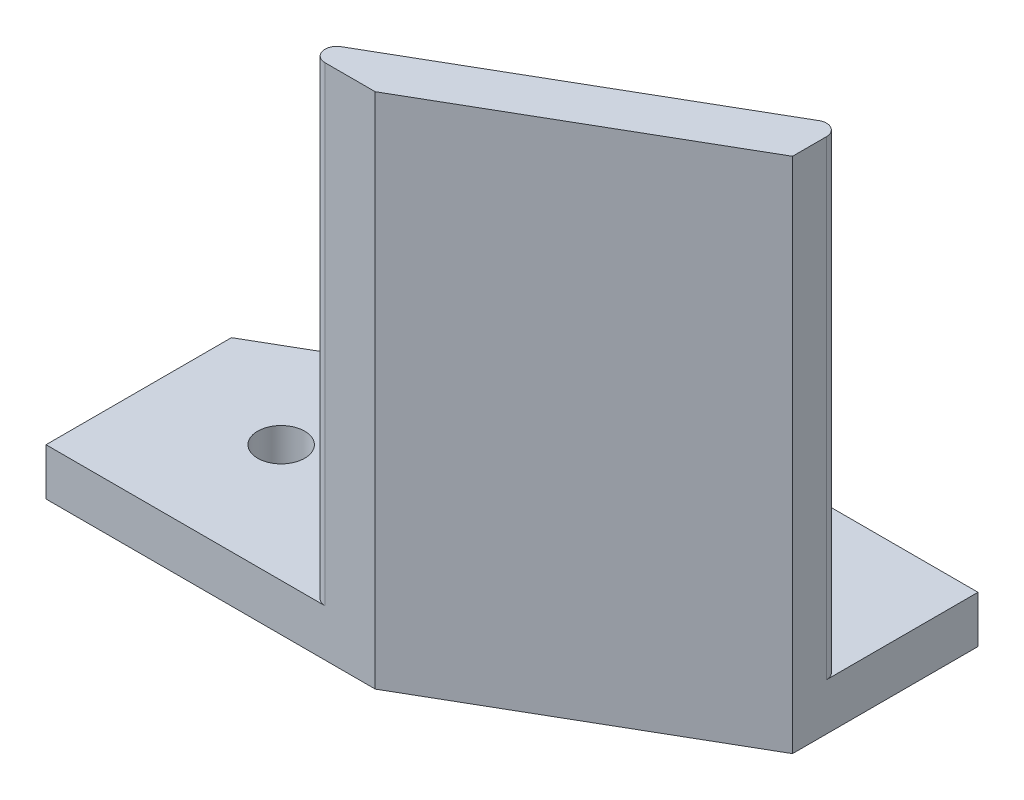
ISO-10303-21;
HEADER;
FILE_DESCRIPTION(('STEP AP214'),'2;1');
FILE_NAME('part.step','',(''),(''),'','','');
FILE_SCHEMA(('AUTOMOTIVE_DESIGN { 1 0 10303 214 1 1 1 1 }'));
ENDSEC;
DATA;
#1=APPLICATION_CONTEXT('core data for automotive mechanical design processes');
#2=APPLICATION_PROTOCOL_DEFINITION('international standard','automotive_design',2000,#1);
#3=PRODUCT_CONTEXT('',#1,'mechanical');
#4=PRODUCT('Part','Part','',(#3));
#5=PRODUCT_RELATED_PRODUCT_CATEGORY('part','',(#4));
#6=PRODUCT_DEFINITION_FORMATION('','',#4);
#7=PRODUCT_DEFINITION_CONTEXT('part definition',#1,'design');
#8=PRODUCT_DEFINITION('design','',#6,#7);
#9=PRODUCT_DEFINITION_SHAPE('','',#8);
#10=(LENGTH_UNIT() NAMED_UNIT(*) SI_UNIT(.MILLI.,.METRE.));
#11=(NAMED_UNIT(*) PLANE_ANGLE_UNIT() SI_UNIT($,.RADIAN.));
#12=(NAMED_UNIT(*) SI_UNIT($,.STERADIAN.) SOLID_ANGLE_UNIT());
#13=UNCERTAINTY_MEASURE_WITH_UNIT(LENGTH_MEASURE(1.E-05),#10,'distance_accuracy_value','');
#14=(GEOMETRIC_REPRESENTATION_CONTEXT(3) GLOBAL_UNCERTAINTY_ASSIGNED_CONTEXT((#13)) GLOBAL_UNIT_ASSIGNED_CONTEXT((#10,
#11,#12)) REPRESENTATION_CONTEXT('',''));
#15=CARTESIAN_POINT('',(0.,0.,0.));
#16=DIRECTION('',(0.,0.,1.));
#17=DIRECTION('',(1.,0.,0.));
#18=AXIS2_PLACEMENT_3D('',#15,#16,#17);
#19=CARTESIAN_POINT('',(71.,51.986195028983,0.));
#20=DIRECTION('',(0.,-1.,0.));
#21=DIRECTION('',(-1.,0.,0.));
#22=AXIS2_PLACEMENT_3D('',#19,#20,#21);
#23=PLANE('',#22);
#24=CARTESIAN_POINT('',(47.0897459621554,51.986195028983,18.));
#25=DIRECTION('',(0.,1.,0.));
#26=DIRECTION('',(-1.,0.,0.));
#27=AXIS2_PLACEMENT_3D('',#24,#25,#26);
#28=CIRCLE('',#27,1.00000000000001);
#29=CARTESIAN_POINT('',(46.0897459621554,51.986195028983,18.));
#30=VERTEX_POINT('',#29);
#31=EDGE_CURVE('E202',#30,#30,#28,.T.);
#32=ORIENTED_EDGE('',*,*,#31,.F.);
#33=EDGE_LOOP('',(#32));
#34=FACE_BOUND('',#33,.T.);
#35=CARTESIAN_POINT('',(40.5,51.986195028983,21.8045916051417));
#36=DIRECTION('',(0.,1.,0.));
#37=DIRECTION('',(-1.,0.,0.));
#38=AXIS2_PLACEMENT_3D('',#35,#36,#37);
#39=CIRCLE('',#38,1.);
#40=CARTESIAN_POINT('',(39.5,51.986195028983,21.8045916051417));
#41=VERTEX_POINT('',#40);
#42=EDGE_CURVE('E199',#41,#41,#39,.F.);
#43=ORIENTED_EDGE('',*,*,#42,.T.);
#44=EDGE_LOOP('',(#43));
#45=FACE_BOUND('',#44,.T.);
#46=DIRECTION('',(0.866025403784442,0.,-0.499999999999995));
#47=VECTOR('',#46,1.);
#48=CARTESIAN_POINT('',(76.23172863406,51.986195028983,9.06161980560487));
#49=LINE('',#48,#47);
#50=CARTESIAN_POINT('',(47.1160254037845,51.986195028983,25.8715789032495));
#51=VERTEX_POINT('',#50);
#52=CARTESIAN_POINT('',(60.,51.986195028983,18.4330127018922));
#53=VERTEX_POINT('',#52);
#54=EDGE_CURVE('E141',#51,#53,#49,.T.);
#55=ORIENTED_EDGE('',*,*,#54,.T.);
#56=CARTESIAN_POINT('',(60.25,51.986195028983,18.8660254037844));
#57=DIRECTION('',(0.,1.,0.));
#58=DIRECTION('',(-1.,0.,0.));
#59=AXIS2_PLACEMENT_3D('',#56,#57,#58);
#60=CIRCLE('',#59,0.5);
#61=CARTESIAN_POINT('',(60.75,51.986195028983,18.8660254037844));
#62=VERTEX_POINT('',#61);
#63=EDGE_CURVE('E53',#62,#53,#60,.T.);
#64=ORIENTED_EDGE('',*,*,#63,.F.);
#65=DIRECTION('',(0.,0.,-1.));
#66=VECTOR('',#65,1.);
#67=CARTESIAN_POINT('',(60.75,51.986195028983,0.));
#68=LINE('',#67,#66);
#69=CARTESIAN_POINT('',(60.75,51.986195028983,12.4226497308104));
#70=VERTEX_POINT('',#69);
#71=EDGE_CURVE('E207',#62,#70,#68,.T.);
#72=ORIENTED_EDGE('',*,*,#71,.T.);
#73=DIRECTION('',(1.,0.,0.));
#74=VECTOR('',#73,1.);
#75=CARTESIAN_POINT('',(71.,51.986195028983,12.4226497308104));
#76=LINE('',#75,#74);
#77=CARTESIAN_POINT('',(46.7499999999998,51.986195028983,12.4226497308104));
#78=VERTEX_POINT('',#77);
#79=EDGE_CURVE('E209',#78,#70,#76,.T.);
#80=ORIENTED_EDGE('',*,*,#79,.F.);
#81=DIRECTION('',(0.866025403784439,0.,-0.5));
#82=VECTOR('',#81,1.);
#83=CARTESIAN_POINT('',(70.3166651245988,51.986195028983,-1.18357072277864));
#84=LINE('',#83,#82);
#85=CARTESIAN_POINT('',(35.5,51.986195028983,18.9178402591935));
#86=VERTEX_POINT('',#85);
#87=EDGE_CURVE('E212',#86,#78,#84,.T.);
#88=ORIENTED_EDGE('',*,*,#87,.F.);
#89=DIRECTION('',(0.,0.,1.));
#90=VECTOR('',#89,1.);
#91=CARTESIAN_POINT('',(35.5,51.986195028983,0.));
#92=LINE('',#91,#90);
#93=CARTESIAN_POINT('',(35.5,51.986195028983,26.8045916051417));
#94=VERTEX_POINT('',#93);
#95=EDGE_CURVE('E183',#86,#94,#92,.T.);
#96=ORIENTED_EDGE('',*,*,#95,.T.);
#97=DIRECTION('',(1.,0.,0.));
#98=VECTOR('',#97,1.);
#99=CARTESIAN_POINT('',(71.,51.986195028983,26.8045916051417));
#100=LINE('',#99,#98);
#101=CARTESIAN_POINT('',(47.3660254037845,51.986195028983,26.8045916051417));
#102=VERTEX_POINT('',#101);
#103=EDGE_CURVE('E205',#94,#102,#100,.T.);
#104=ORIENTED_EDGE('',*,*,#103,.T.);
#105=CARTESIAN_POINT('',(47.3660254037845,51.986195028983,26.3045916051417));
#106=DIRECTION('',(0.,1.,0.));
#107=DIRECTION('',(-1.,0.,0.));
#108=AXIS2_PLACEMENT_3D('',#105,#106,#107);
#109=CIRCLE('',#108,0.5);
#110=EDGE_CURVE('E11',#51,#102,#109,.T.);
#111=ORIENTED_EDGE('',*,*,#110,.F.);
#112=EDGE_LOOP('',(#55,#64,#72,#80,#88,#96,#104,#111));
#113=FACE_BOUND('',#112,.T.);
#114=ADVANCED_FACE('F45',(#34,#45,#113),#23,.F.);
#115=CARTESIAN_POINT('',(71.,49.986195028983,26.8045916051417));
#116=DIRECTION('',(0.,0.,-1.));
#117=DIRECTION('',(0.,1.,0.));
#118=AXIS2_PLACEMENT_3D('',#115,#116,#117);
#119=PLANE('',#118);
#120=ORIENTED_EDGE('',*,*,#103,.F.);
#121=DIRECTION('',(0.,1.,0.));
#122=VECTOR('',#121,1.);
#123=CARTESIAN_POINT('',(35.5,49.986195028983,26.8045916051417));
#124=LINE('',#123,#122);
#125=CARTESIAN_POINT('',(35.5,49.986195028983,26.8045916051417));
#126=VERTEX_POINT('',#125);
#127=EDGE_CURVE('E198',#126,#94,#124,.T.);
#128=ORIENTED_EDGE('',*,*,#127,.F.);
#129=DIRECTION('',(1.,0.,0.));
#130=VECTOR('',#129,1.);
#131=CARTESIAN_POINT('',(71.,49.986195028983,26.8045916051417));
#132=LINE('',#131,#130);
#133=CARTESIAN_POINT('',(49.5000000000002,49.986195028983,26.8045916051417));
#134=VERTEX_POINT('',#133);
#135=EDGE_CURVE('E186',#126,#134,#132,.T.);
#136=ORIENTED_EDGE('',*,*,#135,.T.);
#137=DIRECTION('',(0.,1.,0.));
#138=VECTOR('',#137,1.);
#139=CARTESIAN_POINT('',(49.5000000000002,49.986195028983,26.8045916051417));
#140=LINE('',#139,#138);
#141=CARTESIAN_POINT('',(49.5000000000002,71.986195028983,26.8045916051417));
#142=VERTEX_POINT('',#141);
#143=EDGE_CURVE('E145',#134,#142,#140,.T.);
#144=ORIENTED_EDGE('',*,*,#143,.T.);
#145=DIRECTION('',(1.,0.,0.));
#146=VECTOR('',#145,1.);
#147=CARTESIAN_POINT('',(71.,71.986195028983,26.8045916051417));
#148=LINE('',#147,#146);
#149=CARTESIAN_POINT('',(47.3660254037845,71.986195028983,26.8045916051417));
#150=VERTEX_POINT('',#149);
#151=EDGE_CURVE('E137',#150,#142,#148,.T.);
#152=ORIENTED_EDGE('',*,*,#151,.F.);
#153=DIRECTION('',(0.,-1.,0.));
#154=VECTOR('',#153,1.);
#155=CARTESIAN_POINT('',(47.3660254037845,49.986195028983,26.8045916051417));
#156=LINE('',#155,#154);
#157=EDGE_CURVE('E60',#102,#150,#156,.F.);
#158=ORIENTED_EDGE('',*,*,#157,.F.);
#159=EDGE_LOOP('',(#120,#128,#136,#144,#152,#158));
#160=FACE_BOUND('',#159,.T.);
#161=ADVANCED_FACE('F237',(#160),#119,.F.);
#162=CARTESIAN_POINT('',(77.23172863406,49.986195028983,10.7936706131736));
#163=DIRECTION('',(-0.5,0.,-0.866025403784438));
#164=DIRECTION('',(0.866025403784439,0.,-0.5));
#165=AXIS2_PLACEMENT_3D('',#162,#163,#164);
#166=PLANE('',#165);
#167=ORIENTED_EDGE('',*,*,#143,.F.);
#168=DIRECTION('',(0.866025403784439,0.,-0.5));
#169=VECTOR('',#168,1.);
#170=CARTESIAN_POINT('',(77.23172863406,49.986195028983,10.7936706131736));
#171=LINE('',#170,#169);
#172=CARTESIAN_POINT('',(60.75,49.986195028983,20.3094010767585));
#173=VERTEX_POINT('',#172);
#174=EDGE_CURVE('E144',#134,#173,#171,.T.);
#175=ORIENTED_EDGE('',*,*,#174,.T.);
#176=DIRECTION('',(0.,1.,0.));
#177=VECTOR('',#176,1.);
#178=CARTESIAN_POINT('',(60.75,49.986195028983,20.3094010767585));
#179=LINE('',#178,#177);
#180=CARTESIAN_POINT('',(60.75,71.986195028983,20.3094010767585));
#181=VERTEX_POINT('',#180);
#182=EDGE_CURVE('E129',#173,#181,#179,.T.);
#183=ORIENTED_EDGE('',*,*,#182,.T.);
#184=DIRECTION('',(0.866025403784439,0.,-0.5));
#185=VECTOR('',#184,1.);
#186=CARTESIAN_POINT('',(77.23172863406,71.986195028983,10.7936706131736));
#187=LINE('',#186,#185);
#188=EDGE_CURVE('E134',#142,#181,#187,.T.);
#189=ORIENTED_EDGE('',*,*,#188,.F.);
#190=EDGE_LOOP('',(#167,#175,#183,#189));
#191=FACE_BOUND('',#190,.T.);
#192=ADVANCED_FACE('F143',(#191),#166,.F.);
#193=CARTESIAN_POINT('',(60.75,49.986195028983,0.));
#194=DIRECTION('',(-1.,0.,0.));
#195=DIRECTION('',(0.,0.,-1.));
#196=AXIS2_PLACEMENT_3D('',#193,#194,#195);
#197=PLANE('',#196);
#198=DIRECTION('',(0.,0.,-1.));
#199=VECTOR('',#198,1.);
#200=CARTESIAN_POINT('',(60.75,71.986195028983,0.));
#201=LINE('',#200,#199);
#202=CARTESIAN_POINT('',(60.75,71.986195028983,18.8660254037844));
#203=VERTEX_POINT('',#202);
#204=EDGE_CURVE('E124',#181,#203,#201,.T.);
#205=ORIENTED_EDGE('',*,*,#204,.F.);
#206=ORIENTED_EDGE('',*,*,#182,.F.);
#207=DIRECTION('',(0.,0.,-1.));
#208=VECTOR('',#207,1.);
#209=CARTESIAN_POINT('',(60.75,49.986195028983,0.));
#210=LINE('',#209,#208);
#211=CARTESIAN_POINT('',(60.75,49.986195028983,12.4226497308104));
#212=VERTEX_POINT('',#211);
#213=EDGE_CURVE('E190',#173,#212,#210,.T.);
#214=ORIENTED_EDGE('',*,*,#213,.T.);
#215=DIRECTION('',(0.,1.,0.));
#216=VECTOR('',#215,1.);
#217=CARTESIAN_POINT('',(60.75,49.986195028983,12.4226497308104));
#218=LINE('',#217,#216);
#219=EDGE_CURVE('E146',#212,#70,#218,.T.);
#220=ORIENTED_EDGE('',*,*,#219,.T.);
#221=ORIENTED_EDGE('',*,*,#71,.F.);
#222=DIRECTION('',(0.,-1.,0.));
#223=VECTOR('',#222,1.);
#224=CARTESIAN_POINT('',(60.75,49.986195028983,18.8660254037844));
#225=LINE('',#224,#223);
#226=EDGE_CURVE('E132',#203,#62,#225,.T.);
#227=ORIENTED_EDGE('',*,*,#226,.F.);
#228=EDGE_LOOP('',(#205,#206,#214,#220,#221,#227));
#229=FACE_BOUND('',#228,.T.);
#230=ADVANCED_FACE('F126',(#229),#197,.F.);
#231=CARTESIAN_POINT('',(71.,49.986195028983,12.4226497308104));
#232=DIRECTION('',(0.,0.,-1.));
#233=DIRECTION('',(1.,0.,0.));
#234=AXIS2_PLACEMENT_3D('',#231,#232,#233);
#235=PLANE('',#234);
#236=ORIENTED_EDGE('',*,*,#79,.T.);
#237=ORIENTED_EDGE('',*,*,#219,.F.);
#238=DIRECTION('',(1.,0.,0.));
#239=VECTOR('',#238,1.);
#240=CARTESIAN_POINT('',(71.,49.986195028983,12.4226497308104));
#241=LINE('',#240,#239);
#242=CARTESIAN_POINT('',(46.7499999999998,49.986195028983,12.4226497308104));
#243=VERTEX_POINT('',#242);
#244=EDGE_CURVE('E192',#243,#212,#241,.T.);
#245=ORIENTED_EDGE('',*,*,#244,.F.);
#246=DIRECTION('',(0.,1.,0.));
#247=VECTOR('',#246,1.);
#248=CARTESIAN_POINT('',(46.7499999999998,49.986195028983,12.4226497308104));
#249=LINE('',#248,#247);
#250=EDGE_CURVE('E149',#243,#78,#249,.T.);
#251=ORIENTED_EDGE('',*,*,#250,.T.);
#252=EDGE_LOOP('',(#236,#237,#245,#251));
#253=FACE_BOUND('',#252,.T.);
#254=ADVANCED_FACE('F222',(#253),#235,.T.);
#255=CARTESIAN_POINT('',(70.3166651245988,49.986195028983,-1.18357072277864));
#256=DIRECTION('',(-0.5,0.,-0.866025403784438));
#257=DIRECTION('',(0.866025403784439,0.,-0.5));
#258=AXIS2_PLACEMENT_3D('',#255,#256,#257);
#259=PLANE('',#258);
#260=ORIENTED_EDGE('',*,*,#87,.T.);
#261=ORIENTED_EDGE('',*,*,#250,.F.);
#262=DIRECTION('',(0.866025403784439,0.,-0.5));
#263=VECTOR('',#262,1.);
#264=CARTESIAN_POINT('',(70.3166651245988,49.986195028983,-1.18357072277864));
#265=LINE('',#264,#263);
#266=CARTESIAN_POINT('',(35.5,49.986195028983,18.9178402591935));
#267=VERTEX_POINT('',#266);
#268=EDGE_CURVE('E194',#267,#243,#265,.T.);
#269=ORIENTED_EDGE('',*,*,#268,.F.);
#270=DIRECTION('',(0.,1.,0.));
#271=VECTOR('',#270,1.);
#272=CARTESIAN_POINT('',(35.5,49.986195028983,18.9178402591935));
#273=LINE('',#272,#271);
#274=EDGE_CURVE('E218',#267,#86,#273,.T.);
#275=ORIENTED_EDGE('',*,*,#274,.T.);
#276=EDGE_LOOP('',(#260,#261,#269,#275));
#277=FACE_BOUND('',#276,.T.);
#278=ADVANCED_FACE('F228',(#277),#259,.T.);
#279=CARTESIAN_POINT('',(47.0897459621554,49.986195028983,18.));
#280=DIRECTION('',(0.,1.,0.));
#281=DIRECTION('',(1.,0.,0.));
#282=AXIS2_PLACEMENT_3D('',#279,#280,#281);
#283=CYLINDRICAL_SURFACE('',#282,1.00000000000001);
#284=CARTESIAN_POINT('',(47.0897459621554,49.986195028983,18.));
#285=DIRECTION('',(0.,1.,0.));
#286=DIRECTION('',(-1.,0.,0.));
#287=AXIS2_PLACEMENT_3D('',#284,#285,#286);
#288=CIRCLE('',#287,1.00000000000001);
#289=CARTESIAN_POINT('',(46.0897459621554,49.986195028983,18.));
#290=VERTEX_POINT('',#289);
#291=EDGE_CURVE('E182',#290,#290,#288,.T.);
#292=ORIENTED_EDGE('',*,*,#291,.F.);
#293=EDGE_LOOP('',(#292));
#294=FACE_BOUND('',#293,.T.);
#295=ORIENTED_EDGE('',*,*,#31,.T.);
#296=EDGE_LOOP('',(#295));
#297=FACE_BOUND('',#296,.T.);
#298=ADVANCED_FACE('F264',(#294,#297),#283,.F.);
#299=CARTESIAN_POINT('',(40.5,49.986195028983,21.8045916051417));
#300=DIRECTION('',(0.,1.,0.));
#301=DIRECTION('',(1.,0.,0.));
#302=AXIS2_PLACEMENT_3D('',#299,#300,#301);
#303=CYLINDRICAL_SURFACE('',#302,1.);
#304=CARTESIAN_POINT('',(40.5,49.986195028983,21.8045916051417));
#305=DIRECTION('',(0.,1.,0.));
#306=DIRECTION('',(-1.,0.,0.));
#307=AXIS2_PLACEMENT_3D('',#304,#305,#306);
#308=CIRCLE('',#307,1.);
#309=CARTESIAN_POINT('',(39.5,49.986195028983,21.8045916051417));
#310=VERTEX_POINT('',#309);
#311=EDGE_CURVE('E179',#310,#310,#308,.F.);
#312=ORIENTED_EDGE('',*,*,#311,.T.);
#313=EDGE_LOOP('',(#312));
#314=FACE_BOUND('',#313,.T.);
#315=ORIENTED_EDGE('',*,*,#42,.F.);
#316=EDGE_LOOP('',(#315));
#317=FACE_BOUND('',#316,.T.);
#318=ADVANCED_FACE('F261',(#314,#317),#303,.F.);
#319=CARTESIAN_POINT('',(35.5,49.986195028983,0.));
#320=DIRECTION('',(1.,0.,0.));
#321=DIRECTION('',(0.,-1.,0.));
#322=AXIS2_PLACEMENT_3D('',#319,#320,#321);
#323=PLANE('',#322);
#324=ORIENTED_EDGE('',*,*,#95,.F.);
#325=ORIENTED_EDGE('',*,*,#274,.F.);
#326=DIRECTION('',(0.,0.,1.));
#327=VECTOR('',#326,1.);
#328=CARTESIAN_POINT('',(35.5,49.986195028983,0.));
#329=LINE('',#328,#327);
#330=EDGE_CURVE('E196',#267,#126,#329,.T.);
#331=ORIENTED_EDGE('',*,*,#330,.T.);
#332=ORIENTED_EDGE('',*,*,#127,.T.);
#333=EDGE_LOOP('',(#324,#325,#331,#332));
#334=FACE_BOUND('',#333,.T.);
#335=ADVANCED_FACE('F236',(#334),#323,.F.);
#336=CARTESIAN_POINT('',(71.,49.986195028983,0.));
#337=DIRECTION('',(0.,-1.,0.));
#338=DIRECTION('',(-1.,0.,0.));
#339=AXIS2_PLACEMENT_3D('',#336,#337,#338);
#340=PLANE('',#339);
#341=ORIENTED_EDGE('',*,*,#311,.F.);
#342=EDGE_LOOP('',(#341));
#343=FACE_BOUND('',#342,.T.);
#344=ORIENTED_EDGE('',*,*,#291,.T.);
#345=EDGE_LOOP('',(#344));
#346=FACE_BOUND('',#345,.T.);
#347=ORIENTED_EDGE('',*,*,#135,.F.);
#348=ORIENTED_EDGE('',*,*,#330,.F.);
#349=ORIENTED_EDGE('',*,*,#268,.T.);
#350=ORIENTED_EDGE('',*,*,#244,.T.);
#351=ORIENTED_EDGE('',*,*,#213,.F.);
#352=ORIENTED_EDGE('',*,*,#174,.F.);
#353=EDGE_LOOP('',(#347,#348,#349,#350,#351,#352));
#354=FACE_BOUND('',#353,.T.);
#355=ADVANCED_FACE('F233',(#343,#346,#354),#340,.T.);
#356=CARTESIAN_POINT('',(76.2317286340599,71.986195028983,9.06161980560487));
#357=DIRECTION('',(0.499999999999995,0.,0.866025403784442));
#358=DIRECTION('',(-0.866025403784442,0.,0.499999999999995));
#359=AXIS2_PLACEMENT_3D('',#356,#357,#358);
#360=PLANE('',#359);
#361=ORIENTED_EDGE('',*,*,#54,.F.);
#362=DIRECTION('',(0.,-1.,0.));
#363=VECTOR('',#362,1.);
#364=CARTESIAN_POINT('',(47.1160254037845,71.986195028983,25.8715789032494));
#365=LINE('',#364,#363);
#366=CARTESIAN_POINT('',(47.1160254037844,71.986195028983,25.8715789032495));
#367=VERTEX_POINT('',#366);
#368=EDGE_CURVE('E154',#367,#51,#365,.T.);
#369=ORIENTED_EDGE('',*,*,#368,.F.);
#370=DIRECTION('',(0.866025403784442,0.,-0.499999999999995));
#371=VECTOR('',#370,1.);
#372=CARTESIAN_POINT('',(76.2317286340599,71.986195028983,9.06161980560487));
#373=LINE('',#372,#371);
#374=CARTESIAN_POINT('',(60.,71.986195028983,18.4330127018922));
#375=VERTEX_POINT('',#374);
#376=EDGE_CURVE('E133',#367,#375,#373,.T.);
#377=ORIENTED_EDGE('',*,*,#376,.T.);
#378=DIRECTION('',(0.,-1.,0.));
#379=VECTOR('',#378,1.);
#380=CARTESIAN_POINT('',(60.,71.986195028983,18.4330127018922));
#381=LINE('',#380,#379);
#382=EDGE_CURVE('E156',#53,#375,#381,.F.);
#383=ORIENTED_EDGE('',*,*,#382,.F.);
#384=EDGE_LOOP('',(#361,#369,#377,#383));
#385=FACE_BOUND('',#384,.T.);
#386=ADVANCED_FACE('F238',(#385),#360,.F.);
#387=CARTESIAN_POINT('',(71.,71.986195028983,0.));
#388=DIRECTION('',(0.,-1.,0.));
#389=DIRECTION('',(-1.,0.,0.));
#390=AXIS2_PLACEMENT_3D('',#387,#388,#389);
#391=PLANE('',#390);
#392=ORIENTED_EDGE('',*,*,#376,.F.);
#393=CARTESIAN_POINT('',(47.3660254037845,71.986195028983,26.3045916051417));
#394=DIRECTION('',(0.,1.,0.));
#395=DIRECTION('',(-1.,0.,0.));
#396=AXIS2_PLACEMENT_3D('',#393,#394,#395);
#397=CIRCLE('',#396,0.5);
#398=EDGE_CURVE('E67',#150,#367,#397,.F.);
#399=ORIENTED_EDGE('',*,*,#398,.F.);
#400=ORIENTED_EDGE('',*,*,#151,.T.);
#401=ORIENTED_EDGE('',*,*,#188,.T.);
#402=ORIENTED_EDGE('',*,*,#204,.T.);
#403=CARTESIAN_POINT('',(60.25,71.986195028983,18.8660254037844));
#404=DIRECTION('',(0.,1.,0.));
#405=DIRECTION('',(-1.,0.,0.));
#406=AXIS2_PLACEMENT_3D('',#403,#404,#405);
#407=CIRCLE('',#406,0.5);
#408=EDGE_CURVE('E160',#375,#203,#407,.F.);
#409=ORIENTED_EDGE('',*,*,#408,.F.);
#410=EDGE_LOOP('',(#392,#399,#400,#401,#402,#409));
#411=FACE_BOUND('',#410,.T.);
#412=ADVANCED_FACE('F136',(#411),#391,.F.);
#413=CARTESIAN_POINT('',(60.25,49.986195028983,18.8660254037844));
#414=DIRECTION('',(0.,-1.,0.));
#415=DIRECTION('',(-1.,0.,0.));
#416=AXIS2_PLACEMENT_3D('',#413,#414,#415);
#417=CYLINDRICAL_SURFACE('',#416,0.5);
#418=ORIENTED_EDGE('',*,*,#408,.T.);
#419=ORIENTED_EDGE('',*,*,#226,.T.);
#420=ORIENTED_EDGE('',*,*,#63,.T.);
#421=ORIENTED_EDGE('',*,*,#382,.T.);
#422=EDGE_LOOP('',(#418,#419,#420,#421));
#423=FACE_BOUND('',#422,.T.);
#424=ADVANCED_FACE('F166',(#423),#417,.T.);
#425=CARTESIAN_POINT('',(47.3660254037845,71.986195028983,26.3045916051417));
#426=DIRECTION('',(0.,-1.,0.));
#427=DIRECTION('',(-1.,0.,0.));
#428=AXIS2_PLACEMENT_3D('',#425,#426,#427);
#429=CYLINDRICAL_SURFACE('',#428,0.5);
#430=ORIENTED_EDGE('',*,*,#398,.T.);
#431=ORIENTED_EDGE('',*,*,#368,.T.);
#432=ORIENTED_EDGE('',*,*,#110,.T.);
#433=ORIENTED_EDGE('',*,*,#157,.T.);
#434=EDGE_LOOP('',(#430,#431,#432,#433));
#435=FACE_BOUND('',#434,.T.);
#436=ADVANCED_FACE('F47',(#435),#429,.T.);
#437=CLOSED_SHELL('',(#114,#161,#192,#230,#254,#278,#298,#318,#335,#355,#386,#412,#424,#436));
#438=MANIFOLD_SOLID_BREP('B2',#437);
#439=ADVANCED_BREP_SHAPE_REPRESENTATION('',(#18,#438),#14);
#440=SHAPE_DEFINITION_REPRESENTATION(#9,#439);
ENDSEC;
END-ISO-10303-21;
